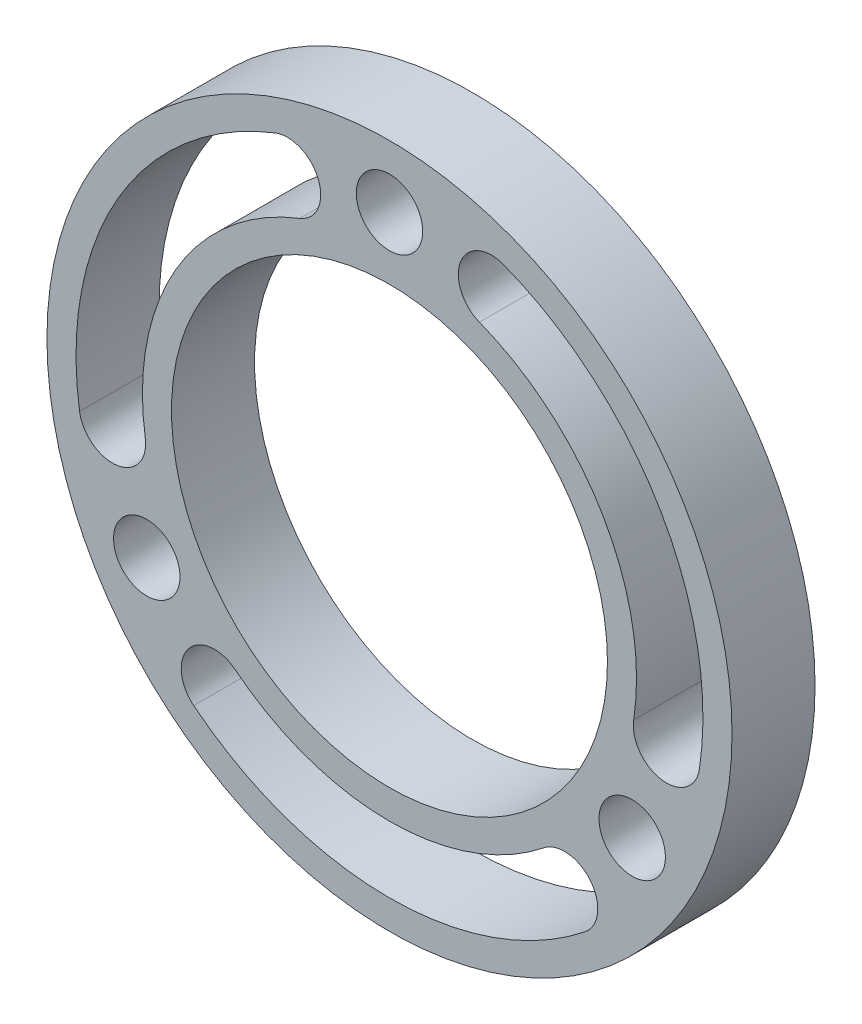
ISO-10303-21;
HEADER;
FILE_DESCRIPTION(('STEP AP214'),'2;1');
FILE_NAME('part.step','',(''),(''),'','','');
FILE_SCHEMA(('AUTOMOTIVE_DESIGN { 1 0 10303 214 1 1 1 1 }'));
ENDSEC;
DATA;
#1=APPLICATION_CONTEXT('core data for automotive mechanical design processes');
#2=APPLICATION_PROTOCOL_DEFINITION('international standard','automotive_design',2000,#1);
#3=PRODUCT_CONTEXT('',#1,'mechanical');
#4=PRODUCT('Part','Part','',(#3));
#5=PRODUCT_RELATED_PRODUCT_CATEGORY('part','',(#4));
#6=PRODUCT_DEFINITION_FORMATION('','',#4);
#7=PRODUCT_DEFINITION_CONTEXT('part definition',#1,'design');
#8=PRODUCT_DEFINITION('design','',#6,#7);
#9=PRODUCT_DEFINITION_SHAPE('','',#8);
#10=(LENGTH_UNIT() NAMED_UNIT(*) SI_UNIT(.MILLI.,.METRE.));
#11=(NAMED_UNIT(*) PLANE_ANGLE_UNIT() SI_UNIT($,.RADIAN.));
#12=(NAMED_UNIT(*) SI_UNIT($,.STERADIAN.) SOLID_ANGLE_UNIT());
#13=UNCERTAINTY_MEASURE_WITH_UNIT(LENGTH_MEASURE(1.E-05),#10,'distance_accuracy_value','');
#14=(GEOMETRIC_REPRESENTATION_CONTEXT(3) GLOBAL_UNCERTAINTY_ASSIGNED_CONTEXT((#13)) GLOBAL_UNIT_ASSIGNED_CONTEXT((#10,
#11,#12)) REPRESENTATION_CONTEXT('',''));
#15=CARTESIAN_POINT('',(0.,0.,0.));
#16=DIRECTION('',(0.,0.,1.));
#17=DIRECTION('',(1.,0.,0.));
#18=AXIS2_PLACEMENT_3D('',#15,#16,#17);
#19=CARTESIAN_POINT('',(0.,0.,4.));
#20=DIRECTION('',(0.,0.,1.));
#21=DIRECTION('',(1.,0.,0.));
#22=AXIS2_PLACEMENT_3D('',#19,#20,#21);
#23=PLANE('',#22);
#24=CARTESIAN_POINT('',(11.6913429508832,-6.75,4.));
#25=DIRECTION('',(0.,0.,1.));
#26=DIRECTION('',(1.,0.,0.));
#27=AXIS2_PLACEMENT_3D('',#24,#25,#26);
#28=CIRCLE('',#27,1.59999999995357);
#29=CARTESIAN_POINT('',(13.2913429508368,-6.75,4.));
#30=VERTEX_POINT('',#29);
#31=EDGE_CURVE('E228',#30,#30,#28,.T.);
#32=ORIENTED_EDGE('',*,*,#31,.F.);
#33=EDGE_LOOP('',(#32));
#34=FACE_BOUND('',#33,.T.);
#35=CARTESIAN_POINT('',(0.,0.,4.));
#36=DIRECTION('',(0.,0.,1.));
#37=DIRECTION('',(1.,0.,0.));
#38=AXIS2_PLACEMENT_3D('',#35,#36,#37);
#39=CIRCLE('',#38,10.5);
#40=CARTESIAN_POINT('',(10.5,0.,4.));
#41=VERTEX_POINT('',#40);
#42=EDGE_CURVE('E287',#41,#41,#39,.T.);
#43=ORIENTED_EDGE('',*,*,#42,.F.);
#44=EDGE_LOOP('',(#43));
#45=FACE_BOUND('',#44,.T.);
#46=CARTESIAN_POINT('',(0.,0.,4.));
#47=DIRECTION('',(0.,0.,1.));
#48=DIRECTION('',(1.,0.,0.));
#49=AXIS2_PLACEMENT_3D('',#46,#47,#48);
#50=CIRCLE('',#49,16.5);
#51=CARTESIAN_POINT('',(16.5,0.,4.));
#52=VERTEX_POINT('',#51);
#53=EDGE_CURVE('E11',#52,#52,#50,.T.);
#54=ORIENTED_EDGE('',*,*,#53,.T.);
#55=EDGE_LOOP('',(#54));
#56=FACE_BOUND('',#55,.T.);
#57=CARTESIAN_POINT('',(0.,13.5,4.));
#58=DIRECTION('',(0.,0.,1.));
#59=DIRECTION('',(1.,0.,0.));
#60=AXIS2_PLACEMENT_3D('',#57,#58,#59);
#61=CIRCLE('',#60,1.6);
#62=CARTESIAN_POINT('',(1.6,13.5,4.));
#63=VERTEX_POINT('',#62);
#64=EDGE_CURVE('E279',#63,#63,#61,.T.);
#65=ORIENTED_EDGE('',*,*,#64,.F.);
#66=EDGE_LOOP('',(#65));
#67=FACE_BOUND('',#66,.T.);
#68=CARTESIAN_POINT('',(-4.91351820793393,12.5740740740741,4.));
#69=DIRECTION('',(0.,0.,1.));
#70=DIRECTION('',(1.,0.,0.));
#71=AXIS2_PLACEMENT_3D('',#68,#69,#70);
#72=CIRCLE('',#71,1.59999999999447);
#73=CARTESIAN_POINT('',(-4.33117530921784,11.0838134430778,4.));
#74=VERTEX_POINT('',#73);
#75=CARTESIAN_POINT('',(-5.49586110664946,14.0643347050689,4.));
#76=VERTEX_POINT('',#75);
#77=EDGE_CURVE('E239',#74,#76,#72,.T.);
#78=ORIENTED_EDGE('',*,*,#77,.F.);
#79=CARTESIAN_POINT('',(0.,0.,4.));
#80=DIRECTION('',(0.,0.,-1.));
#81=DIRECTION('',(1.,0.,0.));
#82=AXIS2_PLACEMENT_3D('',#79,#80,#81);
#83=CIRCLE('',#82,11.9000000000117);
#84=CARTESIAN_POINT('',(-11.7644516671568,-1.79099887533338,4.));
#85=VERTEX_POINT('',#84);
#86=EDGE_CURVE('E236',#85,#74,#83,.T.);
#87=ORIENTED_EDGE('',*,*,#86,.F.);
#88=CARTESIAN_POINT('',(-13.3462266812135,-2.03180544680452,4.));
#89=DIRECTION('',(0.,0.,1.));
#90=DIRECTION('',(1.,0.,0.));
#91=AXIS2_PLACEMENT_3D('',#88,#89,#90);
#92=CIRCLE('',#91,1.59999999998677);
#93=CARTESIAN_POINT('',(-14.9280016952702,-2.27261201827565,4.));
#94=VERTEX_POINT('',#93);
#95=EDGE_CURVE('E247',#94,#85,#92,.T.);
#96=ORIENTED_EDGE('',*,*,#95,.F.);
#97=CARTESIAN_POINT('',(0.,0.,4.));
#98=DIRECTION('',(0.,0.,1.));
#99=DIRECTION('',(1.,0.,0.));
#100=AXIS2_PLACEMENT_3D('',#97,#98,#99);
#101=CIRCLE('',#100,15.099999999993);
#102=EDGE_CURVE('E243',#76,#94,#101,.T.);
#103=ORIENTED_EDGE('',*,*,#102,.F.);
#104=EDGE_LOOP('',(#78,#87,#96,#103));
#105=FACE_BOUND('',#104,.T.);
#106=CARTESIAN_POINT('',(-11.6913429511933,-6.74999999982099,4.));
#107=DIRECTION('',(0.,0.,1.));
#108=DIRECTION('',(1.,0.,0.));
#109=AXIS2_PLACEMENT_3D('',#106,#107,#108);
#110=CIRCLE('',#109,1.59999999980245);
#111=CARTESIAN_POINT('',(-10.0913429513908,-6.74999999982099,4.));
#112=VERTEX_POINT('',#111);
#113=EDGE_CURVE('E220',#112,#112,#110,.T.);
#114=ORIENTED_EDGE('',*,*,#113,.F.);
#115=EDGE_LOOP('',(#114));
#116=FACE_BOUND('',#115,.T.);
#117=CARTESIAN_POINT('',(13.3462266811824,-2.03180544700893,4.));
#118=DIRECTION('',(0.,0.,1.));
#119=DIRECTION('',(1.,0.,0.));
#120=AXIS2_PLACEMENT_3D('',#117,#118,#119);
#121=CIRCLE('',#120,1.59999999999448);
#122=CARTESIAN_POINT('',(11.7644516671218,-1.79099887551241,4.));
#123=VERTEX_POINT('',#122);
#124=CARTESIAN_POINT('',(14.9280016952415,-2.27261201850523,4.));
#125=VERTEX_POINT('',#124);
#126=EDGE_CURVE('E180',#123,#125,#121,.T.);
#127=ORIENTED_EDGE('',*,*,#126,.F.);
#128=CARTESIAN_POINT('',(0.,0.,4.));
#129=DIRECTION('',(0.,0.,-1.));
#130=DIRECTION('',(1.,0.,0.));
#131=AXIS2_PLACEMENT_3D('',#128,#129,#130);
#132=CIRCLE('',#131,11.9000000000117);
#133=CARTESIAN_POINT('',(4.33117530939041,11.0838134430187,4.));
#134=VERTEX_POINT('',#133);
#135=EDGE_CURVE('E177',#134,#123,#132,.T.);
#136=ORIENTED_EDGE('',*,*,#135,.F.);
#137=CARTESIAN_POINT('',(4.91351820812651,12.5740740739988,4.));
#138=DIRECTION('',(0.,0.,1.));
#139=DIRECTION('',(1.,0.,0.));
#140=AXIS2_PLACEMENT_3D('',#137,#138,#139);
#141=CIRCLE('',#140,1.59999999998677);
#142=CARTESIAN_POINT('',(5.49586110686262,14.0643347049789,4.));
#143=VERTEX_POINT('',#142);
#144=EDGE_CURVE('E188',#143,#134,#141,.T.);
#145=ORIENTED_EDGE('',*,*,#144,.F.);
#146=CARTESIAN_POINT('',(0.,0.,4.));
#147=DIRECTION('',(0.,0.,1.));
#148=DIRECTION('',(1.,0.,0.));
#149=AXIS2_PLACEMENT_3D('',#146,#147,#148);
#150=CIRCLE('',#149,15.099999999993);
#151=EDGE_CURVE('E184',#125,#143,#150,.T.);
#152=ORIENTED_EDGE('',*,*,#151,.F.);
#153=EDGE_LOOP('',(#127,#136,#145,#152));
#154=FACE_BOUND('',#153,.T.);
#155=CARTESIAN_POINT('',(-8.43270847324857,-10.5422686270651,4.));
#156=DIRECTION('',(0.,0.,1.));
#157=DIRECTION('',(1.,0.,0.));
#158=AXIS2_PLACEMENT_3D('',#155,#156,#157);
#159=CIRCLE('',#158,1.59999999999447);
#160=CARTESIAN_POINT('',(-7.43327635790405,-9.29281456756543,4.));
#161=VERTEX_POINT('',#160);
#162=CARTESIAN_POINT('',(-9.43214058859216,-11.7917226865637,4.));
#163=VERTEX_POINT('',#162);
#164=EDGE_CURVE('E138',#161,#163,#159,.T.);
#165=ORIENTED_EDGE('',*,*,#164,.F.);
#166=CARTESIAN_POINT('',(0.,0.,4.));
#167=DIRECTION('',(0.,0.,-1.));
#168=DIRECTION('',(1.,0.,0.));
#169=AXIS2_PLACEMENT_3D('',#166,#167,#168);
#170=CIRCLE('',#169,11.9000000000117);
#171=CARTESIAN_POINT('',(7.4332763577664,-9.2928145676854,4.));
#172=VERTEX_POINT('',#171);
#173=EDGE_CURVE('E129',#172,#161,#170,.T.);
#174=ORIENTED_EDGE('',*,*,#173,.F.);
#175=CARTESIAN_POINT('',(8.43270847308696,-10.5422686271944,4.));
#176=DIRECTION('',(0.,0.,1.));
#177=DIRECTION('',(1.,0.,0.));
#178=AXIS2_PLACEMENT_3D('',#175,#176,#177);
#179=CIRCLE('',#178,1.59999999998677);
#180=CARTESIAN_POINT('',(9.43214058840752,-11.7917226867034,4.));
#181=VERTEX_POINT('',#180);
#182=EDGE_CURVE('E155',#181,#172,#179,.T.);
#183=ORIENTED_EDGE('',*,*,#182,.F.);
#184=CARTESIAN_POINT('',(0.,0.,4.));
#185=DIRECTION('',(0.,0.,1.));
#186=DIRECTION('',(1.,0.,0.));
#187=AXIS2_PLACEMENT_3D('',#184,#185,#186);
#188=CIRCLE('',#187,15.099999999993);
#189=EDGE_CURVE('E151',#163,#181,#188,.T.);
#190=ORIENTED_EDGE('',*,*,#189,.F.);
#191=EDGE_LOOP('',(#165,#174,#183,#190));
#192=FACE_BOUND('',#191,.T.);
#193=ADVANCED_FACE('F39',(#34,#45,#56,#67,#105,#116,#154,#192),#23,.T.);
#194=CARTESIAN_POINT('',(0.,0.,0.));
#195=DIRECTION('',(0.,0.,1.));
#196=DIRECTION('',(1.,0.,0.));
#197=AXIS2_PLACEMENT_3D('',#194,#195,#196);
#198=PLANE('',#197);
#199=CARTESIAN_POINT('',(0.,0.,0.));
#200=DIRECTION('',(0.,0.,-1.));
#201=DIRECTION('',(1.,0.,0.));
#202=AXIS2_PLACEMENT_3D('',#199,#200,#201);
#203=CIRCLE('',#202,11.9000000000117);
#204=CARTESIAN_POINT('',(4.33117530939041,11.0838134430187,0.));
#205=VERTEX_POINT('',#204);
#206=CARTESIAN_POINT('',(11.7644516671218,-1.79099887551241,0.));
#207=VERTEX_POINT('',#206);
#208=EDGE_CURVE('E147',#205,#207,#203,.T.);
#209=ORIENTED_EDGE('',*,*,#208,.T.);
#210=CARTESIAN_POINT('',(13.3462266811824,-2.03180544700893,0.));
#211=DIRECTION('',(0.,0.,1.));
#212=DIRECTION('',(1.,0.,0.));
#213=AXIS2_PLACEMENT_3D('',#210,#211,#212);
#214=CIRCLE('',#213,1.59999999999448);
#215=CARTESIAN_POINT('',(14.9280016952415,-2.27261201850523,0.));
#216=VERTEX_POINT('',#215);
#217=EDGE_CURVE('E195',#207,#216,#214,.T.);
#218=ORIENTED_EDGE('',*,*,#217,.T.);
#219=CARTESIAN_POINT('',(0.,0.,0.));
#220=DIRECTION('',(0.,0.,1.));
#221=DIRECTION('',(1.,0.,0.));
#222=AXIS2_PLACEMENT_3D('',#219,#220,#221);
#223=CIRCLE('',#222,15.099999999993);
#224=CARTESIAN_POINT('',(5.49586110686262,14.0643347049789,0.));
#225=VERTEX_POINT('',#224);
#226=EDGE_CURVE('E199',#216,#225,#223,.T.);
#227=ORIENTED_EDGE('',*,*,#226,.T.);
#228=CARTESIAN_POINT('',(4.91351820812651,12.5740740739988,0.));
#229=DIRECTION('',(0.,0.,1.));
#230=DIRECTION('',(1.,0.,0.));
#231=AXIS2_PLACEMENT_3D('',#228,#229,#230);
#232=CIRCLE('',#231,1.59999999998677);
#233=EDGE_CURVE('E181',#225,#205,#232,.T.);
#234=ORIENTED_EDGE('',*,*,#233,.T.);
#235=EDGE_LOOP('',(#209,#218,#227,#234));
#236=FACE_BOUND('',#235,.T.);
#237=CARTESIAN_POINT('',(0.,13.5,0.));
#238=DIRECTION('',(0.,0.,1.));
#239=DIRECTION('',(1.,0.,0.));
#240=AXIS2_PLACEMENT_3D('',#237,#238,#239);
#241=CIRCLE('',#240,1.6);
#242=CARTESIAN_POINT('',(1.6,13.5,0.));
#243=VERTEX_POINT('',#242);
#244=EDGE_CURVE('E278',#243,#243,#241,.T.);
#245=ORIENTED_EDGE('',*,*,#244,.T.);
#246=EDGE_LOOP('',(#245));
#247=FACE_BOUND('',#246,.T.);
#248=CARTESIAN_POINT('',(0.,0.,0.));
#249=DIRECTION('',(0.,0.,1.));
#250=DIRECTION('',(1.,0.,0.));
#251=AXIS2_PLACEMENT_3D('',#248,#249,#250);
#252=CIRCLE('',#251,10.5);
#253=CARTESIAN_POINT('',(10.5,0.,0.));
#254=VERTEX_POINT('',#253);
#255=EDGE_CURVE('E283',#254,#254,#252,.T.);
#256=ORIENTED_EDGE('',*,*,#255,.T.);
#257=EDGE_LOOP('',(#256));
#258=FACE_BOUND('',#257,.T.);
#259=CARTESIAN_POINT('',(0.,0.,0.));
#260=DIRECTION('',(0.,0.,1.));
#261=DIRECTION('',(1.,0.,0.));
#262=AXIS2_PLACEMENT_3D('',#259,#260,#261);
#263=CIRCLE('',#262,16.5);
#264=CARTESIAN_POINT('',(16.5,0.,0.));
#265=VERTEX_POINT('',#264);
#266=EDGE_CURVE('E43',#265,#265,#263,.T.);
#267=ORIENTED_EDGE('',*,*,#266,.F.);
#268=EDGE_LOOP('',(#267));
#269=FACE_BOUND('',#268,.T.);
#270=CARTESIAN_POINT('',(0.,0.,0.));
#271=DIRECTION('',(0.,0.,-1.));
#272=DIRECTION('',(1.,0.,0.));
#273=AXIS2_PLACEMENT_3D('',#270,#271,#272);
#274=CIRCLE('',#273,11.9000000000117);
#275=CARTESIAN_POINT('',(-11.7644516671568,-1.79099887533338,0.));
#276=VERTEX_POINT('',#275);
#277=CARTESIAN_POINT('',(-4.33117530921784,11.0838134430778,0.));
#278=VERTEX_POINT('',#277);
#279=EDGE_CURVE('E232',#276,#278,#274,.T.);
#280=ORIENTED_EDGE('',*,*,#279,.T.);
#281=CARTESIAN_POINT('',(-4.91351820793393,12.5740740740741,0.));
#282=DIRECTION('',(0.,0.,1.));
#283=DIRECTION('',(1.,0.,0.));
#284=AXIS2_PLACEMENT_3D('',#281,#282,#283);
#285=CIRCLE('',#284,1.59999999999447);
#286=CARTESIAN_POINT('',(-5.49586110664946,14.0643347050689,0.));
#287=VERTEX_POINT('',#286);
#288=EDGE_CURVE('E254',#278,#287,#285,.T.);
#289=ORIENTED_EDGE('',*,*,#288,.T.);
#290=CARTESIAN_POINT('',(0.,0.,0.));
#291=DIRECTION('',(0.,0.,1.));
#292=DIRECTION('',(1.,0.,0.));
#293=AXIS2_PLACEMENT_3D('',#290,#291,#292);
#294=CIRCLE('',#293,15.099999999993);
#295=CARTESIAN_POINT('',(-14.9280016952702,-2.27261201827565,0.));
#296=VERTEX_POINT('',#295);
#297=EDGE_CURVE('E258',#287,#296,#294,.T.);
#298=ORIENTED_EDGE('',*,*,#297,.T.);
#299=CARTESIAN_POINT('',(-13.3462266812135,-2.03180544680452,0.));
#300=DIRECTION('',(0.,0.,1.));
#301=DIRECTION('',(1.,0.,0.));
#302=AXIS2_PLACEMENT_3D('',#299,#300,#301);
#303=CIRCLE('',#302,1.59999999998677);
#304=EDGE_CURVE('E240',#296,#276,#303,.T.);
#305=ORIENTED_EDGE('',*,*,#304,.T.);
#306=EDGE_LOOP('',(#280,#289,#298,#305));
#307=FACE_BOUND('',#306,.T.);
#308=CARTESIAN_POINT('',(11.6913429508832,-6.75,0.));
#309=DIRECTION('',(0.,0.,1.));
#310=DIRECTION('',(1.,0.,0.));
#311=AXIS2_PLACEMENT_3D('',#308,#309,#310);
#312=CIRCLE('',#311,1.59999999995357);
#313=CARTESIAN_POINT('',(13.2913429508368,-6.75,0.));
#314=VERTEX_POINT('',#313);
#315=EDGE_CURVE('E224',#314,#314,#312,.T.);
#316=ORIENTED_EDGE('',*,*,#315,.T.);
#317=EDGE_LOOP('',(#316));
#318=FACE_BOUND('',#317,.T.);
#319=CARTESIAN_POINT('',(-11.6913429511933,-6.74999999982099,0.));
#320=DIRECTION('',(0.,0.,1.));
#321=DIRECTION('',(1.,0.,0.));
#322=AXIS2_PLACEMENT_3D('',#319,#320,#321);
#323=CIRCLE('',#322,1.59999999980245);
#324=CARTESIAN_POINT('',(-10.0913429513908,-6.74999999982099,0.));
#325=VERTEX_POINT('',#324);
#326=EDGE_CURVE('E219',#325,#325,#323,.T.);
#327=ORIENTED_EDGE('',*,*,#326,.T.);
#328=EDGE_LOOP('',(#327));
#329=FACE_BOUND('',#328,.T.);
#330=CARTESIAN_POINT('',(0.,0.,0.));
#331=DIRECTION('',(0.,0.,-1.));
#332=DIRECTION('',(1.,0.,0.));
#333=AXIS2_PLACEMENT_3D('',#330,#331,#332);
#334=CIRCLE('',#333,11.9000000000117);
#335=CARTESIAN_POINT('',(7.4332763577664,-9.2928145676854,0.));
#336=VERTEX_POINT('',#335);
#337=CARTESIAN_POINT('',(-7.43327635790405,-9.29281456756543,0.));
#338=VERTEX_POINT('',#337);
#339=EDGE_CURVE('E63',#336,#338,#334,.T.);
#340=ORIENTED_EDGE('',*,*,#339,.T.);
#341=CARTESIAN_POINT('',(-8.43270847324857,-10.5422686270651,0.));
#342=DIRECTION('',(0.,0.,1.));
#343=DIRECTION('',(1.,0.,0.));
#344=AXIS2_PLACEMENT_3D('',#341,#342,#343);
#345=CIRCLE('',#344,1.59999999999447);
#346=CARTESIAN_POINT('',(-9.43214058859216,-11.7917226865637,0.));
#347=VERTEX_POINT('',#346);
#348=EDGE_CURVE('E145',#338,#347,#345,.T.);
#349=ORIENTED_EDGE('',*,*,#348,.T.);
#350=CARTESIAN_POINT('',(0.,0.,0.));
#351=DIRECTION('',(0.,0.,1.));
#352=DIRECTION('',(1.,0.,0.));
#353=AXIS2_PLACEMENT_3D('',#350,#351,#352);
#354=CIRCLE('',#353,15.099999999993);
#355=CARTESIAN_POINT('',(9.43214058840752,-11.7917226867034,0.));
#356=VERTEX_POINT('',#355);
#357=EDGE_CURVE('E164',#347,#356,#354,.T.);
#358=ORIENTED_EDGE('',*,*,#357,.T.);
#359=CARTESIAN_POINT('',(8.43270847308696,-10.5422686271944,0.));
#360=DIRECTION('',(0.,0.,1.));
#361=DIRECTION('',(1.,0.,0.));
#362=AXIS2_PLACEMENT_3D('',#359,#360,#361);
#363=CIRCLE('',#362,1.59999999998677);
#364=EDGE_CURVE('E139',#356,#336,#363,.T.);
#365=ORIENTED_EDGE('',*,*,#364,.T.);
#366=EDGE_LOOP('',(#340,#349,#358,#365));
#367=FACE_BOUND('',#366,.T.);
#368=ADVANCED_FACE('F295',(#236,#247,#258,#269,#307,#318,#329,#367),#198,.F.);
#369=CARTESIAN_POINT('',(0.,0.,4.));
#370=DIRECTION('',(0.,0.,-1.));
#371=DIRECTION('',(-1.,0.,0.));
#372=AXIS2_PLACEMENT_3D('',#369,#370,#371);
#373=CYLINDRICAL_SURFACE('',#372,16.5);
#374=ORIENTED_EDGE('',*,*,#53,.F.);
#375=EDGE_LOOP('',(#374));
#376=FACE_BOUND('',#375,.T.);
#377=ORIENTED_EDGE('',*,*,#266,.T.);
#378=EDGE_LOOP('',(#377));
#379=FACE_BOUND('',#378,.T.);
#380=ADVANCED_FACE('F41',(#376,#379),#373,.T.);
#381=CARTESIAN_POINT('',(0.,0.,4.));
#382=DIRECTION('',(0.,0.,-1.));
#383=DIRECTION('',(-1.,0.,0.));
#384=AXIS2_PLACEMENT_3D('',#381,#382,#383);
#385=CYLINDRICAL_SURFACE('',#384,10.5);
#386=ORIENTED_EDGE('',*,*,#42,.T.);
#387=EDGE_LOOP('',(#386));
#388=FACE_BOUND('',#387,.T.);
#389=ORIENTED_EDGE('',*,*,#255,.F.);
#390=EDGE_LOOP('',(#389));
#391=FACE_BOUND('',#390,.T.);
#392=ADVANCED_FACE('F298',(#388,#391),#385,.F.);
#393=CARTESIAN_POINT('',(0.,13.5,4.));
#394=DIRECTION('',(0.,0.,-1.));
#395=DIRECTION('',(-1.,0.,0.));
#396=AXIS2_PLACEMENT_3D('',#393,#394,#395);
#397=CYLINDRICAL_SURFACE('',#396,1.6);
#398=ORIENTED_EDGE('',*,*,#64,.T.);
#399=EDGE_LOOP('',(#398));
#400=FACE_BOUND('',#399,.T.);
#401=ORIENTED_EDGE('',*,*,#244,.F.);
#402=EDGE_LOOP('',(#401));
#403=FACE_BOUND('',#402,.T.);
#404=ADVANCED_FACE('F300',(#400,#403),#397,.F.);
#405=CARTESIAN_POINT('',(0.,0.,4.));
#406=DIRECTION('',(0.,0.,-1.));
#407=DIRECTION('',(-1.,0.,0.));
#408=AXIS2_PLACEMENT_3D('',#405,#406,#407);
#409=CYLINDRICAL_SURFACE('',#408,11.9000000000117);
#410=ORIENTED_EDGE('',*,*,#279,.F.);
#411=DIRECTION('',(0.,0.,-1.));
#412=VECTOR('',#411,1.);
#413=CARTESIAN_POINT('',(-11.7644516671568,-1.79099887533338,4.));
#414=LINE('',#413,#412);
#415=EDGE_CURVE('E250',#85,#276,#414,.T.);
#416=ORIENTED_EDGE('',*,*,#415,.F.);
#417=ORIENTED_EDGE('',*,*,#86,.T.);
#418=DIRECTION('',(0.,0.,-1.));
#419=VECTOR('',#418,1.);
#420=CARTESIAN_POINT('',(-4.33117530921784,11.0838134430778,4.));
#421=LINE('',#420,#419);
#422=EDGE_CURVE('E274',#74,#278,#421,.T.);
#423=ORIENTED_EDGE('',*,*,#422,.T.);
#424=EDGE_LOOP('',(#410,#416,#417,#423));
#425=FACE_BOUND('',#424,.T.);
#426=ADVANCED_FACE('F307',(#425),#409,.T.);
#427=CARTESIAN_POINT('',(-4.91351820793393,12.5740740740741,4.));
#428=DIRECTION('',(0.,0.,-1.));
#429=DIRECTION('',(-1.,0.,0.));
#430=AXIS2_PLACEMENT_3D('',#427,#428,#429);
#431=CYLINDRICAL_SURFACE('',#430,1.59999999999447);
#432=ORIENTED_EDGE('',*,*,#288,.F.);
#433=ORIENTED_EDGE('',*,*,#422,.F.);
#434=ORIENTED_EDGE('',*,*,#77,.T.);
#435=DIRECTION('',(0.,0.,-1.));
#436=VECTOR('',#435,1.);
#437=CARTESIAN_POINT('',(-5.49586110664946,14.0643347050689,4.));
#438=LINE('',#437,#436);
#439=EDGE_CURVE('E271',#76,#287,#438,.T.);
#440=ORIENTED_EDGE('',*,*,#439,.T.);
#441=EDGE_LOOP('',(#432,#433,#434,#440));
#442=FACE_BOUND('',#441,.T.);
#443=ADVANCED_FACE('F379',(#442),#431,.F.);
#444=CARTESIAN_POINT('',(0.,0.,4.));
#445=DIRECTION('',(0.,0.,-1.));
#446=DIRECTION('',(-1.,0.,0.));
#447=AXIS2_PLACEMENT_3D('',#444,#445,#446);
#448=CYLINDRICAL_SURFACE('',#447,15.099999999993);
#449=ORIENTED_EDGE('',*,*,#297,.F.);
#450=ORIENTED_EDGE('',*,*,#439,.F.);
#451=ORIENTED_EDGE('',*,*,#102,.T.);
#452=DIRECTION('',(0.,0.,-1.));
#453=VECTOR('',#452,1.);
#454=CARTESIAN_POINT('',(-14.9280016952702,-2.27261201827565,4.));
#455=LINE('',#454,#453);
#456=EDGE_CURVE('E268',#94,#296,#455,.T.);
#457=ORIENTED_EDGE('',*,*,#456,.T.);
#458=EDGE_LOOP('',(#449,#450,#451,#457));
#459=FACE_BOUND('',#458,.T.);
#460=ADVANCED_FACE('F375',(#459),#448,.F.);
#461=CARTESIAN_POINT('',(-13.3462266812135,-2.03180544680452,4.));
#462=DIRECTION('',(0.,0.,-1.));
#463=DIRECTION('',(-1.,0.,0.));
#464=AXIS2_PLACEMENT_3D('',#461,#462,#463);
#465=CYLINDRICAL_SURFACE('',#464,1.59999999998677);
#466=ORIENTED_EDGE('',*,*,#304,.F.);
#467=ORIENTED_EDGE('',*,*,#456,.F.);
#468=ORIENTED_EDGE('',*,*,#95,.T.);
#469=ORIENTED_EDGE('',*,*,#415,.T.);
#470=EDGE_LOOP('',(#466,#467,#468,#469));
#471=FACE_BOUND('',#470,.T.);
#472=ADVANCED_FACE('F371',(#471),#465,.F.);
#473=CARTESIAN_POINT('',(11.6913429508832,-6.75,4.));
#474=DIRECTION('',(0.,0.,-1.));
#475=DIRECTION('',(-1.,0.,0.));
#476=AXIS2_PLACEMENT_3D('',#473,#474,#475);
#477=CYLINDRICAL_SURFACE('',#476,1.59999999995357);
#478=ORIENTED_EDGE('',*,*,#31,.T.);
#479=EDGE_LOOP('',(#478));
#480=FACE_BOUND('',#479,.T.);
#481=ORIENTED_EDGE('',*,*,#315,.F.);
#482=EDGE_LOOP('',(#481));
#483=FACE_BOUND('',#482,.T.);
#484=ADVANCED_FACE('F367',(#480,#483),#477,.F.);
#485=CARTESIAN_POINT('',(-11.6913429511933,-6.74999999982099,4.));
#486=DIRECTION('',(0.,0.,-1.));
#487=DIRECTION('',(-1.,0.,0.));
#488=AXIS2_PLACEMENT_3D('',#485,#486,#487);
#489=CYLINDRICAL_SURFACE('',#488,1.59999999980245);
#490=ORIENTED_EDGE('',*,*,#113,.T.);
#491=EDGE_LOOP('',(#490));
#492=FACE_BOUND('',#491,.T.);
#493=ORIENTED_EDGE('',*,*,#326,.F.);
#494=EDGE_LOOP('',(#493));
#495=FACE_BOUND('',#494,.T.);
#496=ADVANCED_FACE('F364',(#492,#495),#489,.F.);
#497=CARTESIAN_POINT('',(0.,0.,4.));
#498=DIRECTION('',(0.,0.,-1.));
#499=DIRECTION('',(-1.,0.,0.));
#500=AXIS2_PLACEMENT_3D('',#497,#498,#499);
#501=CYLINDRICAL_SURFACE('',#500,11.9000000000117);
#502=ORIENTED_EDGE('',*,*,#208,.F.);
#503=DIRECTION('',(0.,0.,-1.));
#504=VECTOR('',#503,1.);
#505=CARTESIAN_POINT('',(4.33117530939041,11.0838134430187,4.));
#506=LINE('',#505,#504);
#507=EDGE_CURVE('E191',#134,#205,#506,.T.);
#508=ORIENTED_EDGE('',*,*,#507,.F.);
#509=ORIENTED_EDGE('',*,*,#135,.T.);
#510=DIRECTION('',(0.,0.,-1.));
#511=VECTOR('',#510,1.);
#512=CARTESIAN_POINT('',(11.7644516671218,-1.79099887551241,4.));
#513=LINE('',#512,#511);
#514=EDGE_CURVE('E215',#123,#207,#513,.T.);
#515=ORIENTED_EDGE('',*,*,#514,.T.);
#516=EDGE_LOOP('',(#502,#508,#509,#515));
#517=FACE_BOUND('',#516,.T.);
#518=ADVANCED_FACE('F346',(#517),#501,.T.);
#519=CARTESIAN_POINT('',(13.3462266811824,-2.03180544700893,4.));
#520=DIRECTION('',(0.,0.,-1.));
#521=DIRECTION('',(-1.,0.,0.));
#522=AXIS2_PLACEMENT_3D('',#519,#520,#521);
#523=CYLINDRICAL_SURFACE('',#522,1.59999999999448);
#524=ORIENTED_EDGE('',*,*,#217,.F.);
#525=ORIENTED_EDGE('',*,*,#514,.F.);
#526=ORIENTED_EDGE('',*,*,#126,.T.);
#527=DIRECTION('',(0.,0.,-1.));
#528=VECTOR('',#527,1.);
#529=CARTESIAN_POINT('',(14.9280016952415,-2.27261201850523,4.));
#530=LINE('',#529,#528);
#531=EDGE_CURVE('E212',#125,#216,#530,.T.);
#532=ORIENTED_EDGE('',*,*,#531,.T.);
#533=EDGE_LOOP('',(#524,#525,#526,#532));
#534=FACE_BOUND('',#533,.T.);
#535=ADVANCED_FACE('F339',(#534),#523,.F.);
#536=CARTESIAN_POINT('',(0.,0.,4.));
#537=DIRECTION('',(0.,0.,-1.));
#538=DIRECTION('',(-1.,0.,0.));
#539=AXIS2_PLACEMENT_3D('',#536,#537,#538);
#540=CYLINDRICAL_SURFACE('',#539,15.099999999993);
#541=ORIENTED_EDGE('',*,*,#226,.F.);
#542=ORIENTED_EDGE('',*,*,#531,.F.);
#543=ORIENTED_EDGE('',*,*,#151,.T.);
#544=DIRECTION('',(0.,0.,-1.));
#545=VECTOR('',#544,1.);
#546=CARTESIAN_POINT('',(5.49586110686262,14.0643347049789,4.));
#547=LINE('',#546,#545);
#548=EDGE_CURVE('E209',#143,#225,#547,.T.);
#549=ORIENTED_EDGE('',*,*,#548,.T.);
#550=EDGE_LOOP('',(#541,#542,#543,#549));
#551=FACE_BOUND('',#550,.T.);
#552=ADVANCED_FACE('F342',(#551),#540,.F.);
#553=CARTESIAN_POINT('',(4.91351820812651,12.5740740739988,4.));
#554=DIRECTION('',(0.,0.,-1.));
#555=DIRECTION('',(-1.,0.,0.));
#556=AXIS2_PLACEMENT_3D('',#553,#554,#555);
#557=CYLINDRICAL_SURFACE('',#556,1.59999999998677);
#558=ORIENTED_EDGE('',*,*,#233,.F.);
#559=ORIENTED_EDGE('',*,*,#548,.F.);
#560=ORIENTED_EDGE('',*,*,#144,.T.);
#561=ORIENTED_EDGE('',*,*,#507,.T.);
#562=EDGE_LOOP('',(#558,#559,#560,#561));
#563=FACE_BOUND('',#562,.T.);
#564=ADVANCED_FACE('F349',(#563),#557,.F.);
#565=CARTESIAN_POINT('',(0.,0.,4.));
#566=DIRECTION('',(0.,0.,-1.));
#567=DIRECTION('',(-1.,0.,0.));
#568=AXIS2_PLACEMENT_3D('',#565,#566,#567);
#569=CYLINDRICAL_SURFACE('',#568,11.9000000000117);
#570=ORIENTED_EDGE('',*,*,#339,.F.);
#571=DIRECTION('',(0.,0.,-1.));
#572=VECTOR('',#571,1.);
#573=CARTESIAN_POINT('',(7.4332763577664,-9.2928145676854,4.));
#574=LINE('',#573,#572);
#575=EDGE_CURVE('E133',#172,#336,#574,.T.);
#576=ORIENTED_EDGE('',*,*,#575,.F.);
#577=ORIENTED_EDGE('',*,*,#173,.T.);
#578=DIRECTION('',(0.,0.,-1.));
#579=VECTOR('',#578,1.);
#580=CARTESIAN_POINT('',(-7.43327635790405,-9.29281456756543,4.));
#581=LINE('',#580,#579);
#582=EDGE_CURVE('E132',#161,#338,#581,.T.);
#583=ORIENTED_EDGE('',*,*,#582,.T.);
#584=EDGE_LOOP('',(#570,#576,#577,#583));
#585=FACE_BOUND('',#584,.T.);
#586=ADVANCED_FACE('F131',(#585),#569,.T.);
#587=CARTESIAN_POINT('',(-8.43270847324857,-10.5422686270651,4.));
#588=DIRECTION('',(0.,0.,-1.));
#589=DIRECTION('',(-1.,0.,0.));
#590=AXIS2_PLACEMENT_3D('',#587,#588,#589);
#591=CYLINDRICAL_SURFACE('',#590,1.59999999999447);
#592=ORIENTED_EDGE('',*,*,#348,.F.);
#593=ORIENTED_EDGE('',*,*,#582,.F.);
#594=ORIENTED_EDGE('',*,*,#164,.T.);
#595=DIRECTION('',(0.,0.,-1.));
#596=VECTOR('',#595,1.);
#597=CARTESIAN_POINT('',(-9.43214058859216,-11.7917226865637,4.));
#598=LINE('',#597,#596);
#599=EDGE_CURVE('E148',#163,#347,#598,.T.);
#600=ORIENTED_EDGE('',*,*,#599,.T.);
#601=EDGE_LOOP('',(#592,#593,#594,#600));
#602=FACE_BOUND('',#601,.T.);
#603=ADVANCED_FACE('F142',(#602),#591,.F.);
#604=CARTESIAN_POINT('',(0.,0.,4.));
#605=DIRECTION('',(0.,0.,-1.));
#606=DIRECTION('',(-1.,0.,0.));
#607=AXIS2_PLACEMENT_3D('',#604,#605,#606);
#608=CYLINDRICAL_SURFACE('',#607,15.099999999993);
#609=ORIENTED_EDGE('',*,*,#357,.F.);
#610=ORIENTED_EDGE('',*,*,#599,.F.);
#611=ORIENTED_EDGE('',*,*,#189,.T.);
#612=DIRECTION('',(0.,0.,-1.));
#613=VECTOR('',#612,1.);
#614=CARTESIAN_POINT('',(9.43214058840752,-11.7917226867034,4.));
#615=LINE('',#614,#613);
#616=EDGE_CURVE('E55',#181,#356,#615,.T.);
#617=ORIENTED_EDGE('',*,*,#616,.T.);
#618=EDGE_LOOP('',(#609,#610,#611,#617));
#619=FACE_BOUND('',#618,.T.);
#620=ADVANCED_FACE('F403',(#619),#608,.F.);
#621=CARTESIAN_POINT('',(8.43270847308696,-10.5422686271944,4.));
#622=DIRECTION('',(0.,0.,-1.));
#623=DIRECTION('',(-1.,0.,0.));
#624=AXIS2_PLACEMENT_3D('',#621,#622,#623);
#625=CYLINDRICAL_SURFACE('',#624,1.59999999998677);
#626=ORIENTED_EDGE('',*,*,#364,.F.);
#627=ORIENTED_EDGE('',*,*,#616,.F.);
#628=ORIENTED_EDGE('',*,*,#182,.T.);
#629=ORIENTED_EDGE('',*,*,#575,.T.);
#630=EDGE_LOOP('',(#626,#627,#628,#629));
#631=FACE_BOUND('',#630,.T.);
#632=ADVANCED_FACE('F401',(#631),#625,.F.);
#633=CLOSED_SHELL('',(#193,#368,#380,#392,#404,#426,#443,#460,#472,#484,#496,#518,#535,#552,
#564,#586,#603,#620,#632));
#634=MANIFOLD_SOLID_BREP('B2',#633);
#635=ADVANCED_BREP_SHAPE_REPRESENTATION('',(#18,#634),#14);
#636=SHAPE_DEFINITION_REPRESENTATION(#9,#635);
ENDSEC;
END-ISO-10303-21;
